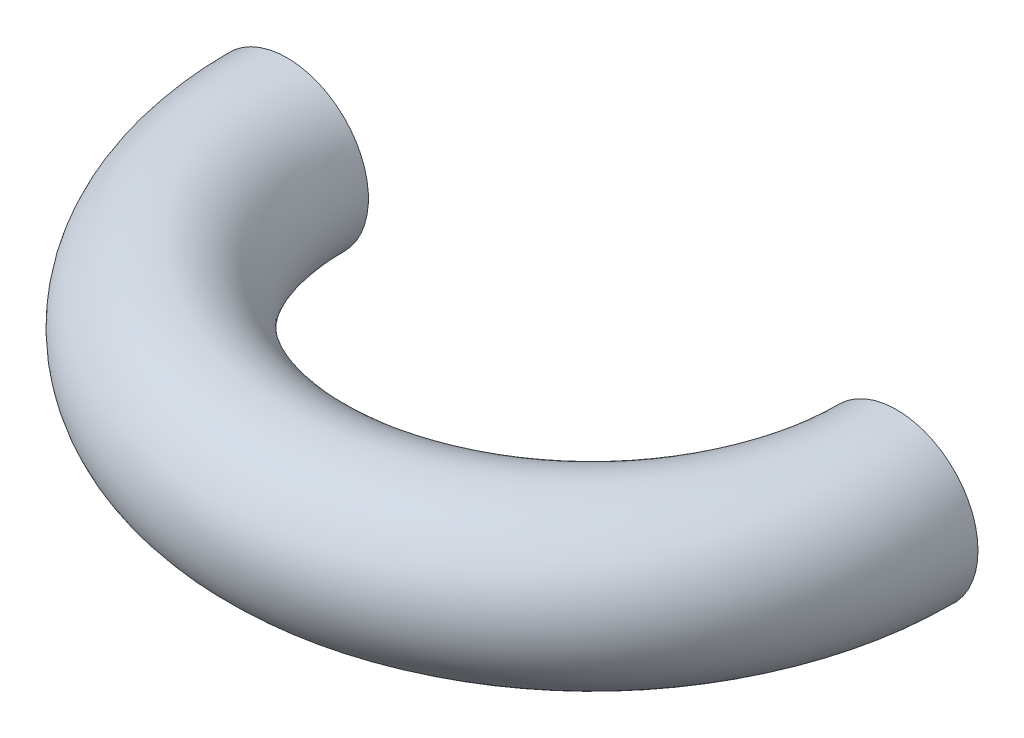
ISO-10303-21;
HEADER;
FILE_DESCRIPTION(('STEP AP214'),'2;1');
FILE_NAME('part.step','',(''),(''),'','','');
FILE_SCHEMA(('AUTOMOTIVE_DESIGN { 1 0 10303 214 1 1 1 1 }'));
ENDSEC;
DATA;
#1=APPLICATION_CONTEXT('core data for automotive mechanical design processes');
#2=APPLICATION_PROTOCOL_DEFINITION('international standard','automotive_design',2000,#1);
#3=PRODUCT_CONTEXT('',#1,'mechanical');
#4=PRODUCT('Part','Part','',(#3));
#5=PRODUCT_RELATED_PRODUCT_CATEGORY('part','',(#4));
#6=PRODUCT_DEFINITION_FORMATION('','',#4);
#7=PRODUCT_DEFINITION_CONTEXT('part definition',#1,'design');
#8=PRODUCT_DEFINITION('design','',#6,#7);
#9=PRODUCT_DEFINITION_SHAPE('','',#8);
#10=(LENGTH_UNIT() NAMED_UNIT(*) SI_UNIT(.MILLI.,.METRE.));
#11=(NAMED_UNIT(*) PLANE_ANGLE_UNIT() SI_UNIT($,.RADIAN.));
#12=(NAMED_UNIT(*) SI_UNIT($,.STERADIAN.) SOLID_ANGLE_UNIT());
#13=UNCERTAINTY_MEASURE_WITH_UNIT(LENGTH_MEASURE(1.E-05),#10,'distance_accuracy_value','');
#14=(GEOMETRIC_REPRESENTATION_CONTEXT(3) GLOBAL_UNCERTAINTY_ASSIGNED_CONTEXT((#13)) GLOBAL_UNIT_ASSIGNED_CONTEXT((#10,
#11,#12)) REPRESENTATION_CONTEXT('',''));
#15=CARTESIAN_POINT('',(0.,0.,0.));
#16=DIRECTION('',(0.,0.,1.));
#17=DIRECTION('',(1.,0.,0.));
#18=AXIS2_PLACEMENT_3D('',#15,#16,#17);
#19=CARTESIAN_POINT('',(0.,0.,0.));
#20=DIRECTION('',(0.,1.,0.));
#21=DIRECTION('',(0.,0.,1.));
#22=AXIS2_PLACEMENT_3D('',#19,#20,#21);
#23=TOROIDAL_SURFACE('',#22,3.75,1.);
#24=CARTESIAN_POINT('',(-3.75,0.,0.));
#25=DIRECTION('',(0.,0.,-1.));
#26=DIRECTION('',(-1.,0.,0.));
#27=AXIS2_PLACEMENT_3D('',#24,#25,#26);
#28=CIRCLE('',#27,1.);
#29=CARTESIAN_POINT('',(-4.75,0.,0.));
#30=VERTEX_POINT('',#29);
#31=EDGE_CURVE('E10',#30,#30,#28,.T.);
#32=CARTESIAN_POINT('',(3.75,0.,0.));
#33=DIRECTION('',(0.,0.,1.));
#34=DIRECTION('',(1.,0.,0.));
#35=AXIS2_PLACEMENT_3D('',#32,#33,#34);
#36=CIRCLE('',#35,1.);
#37=CARTESIAN_POINT('',(4.75,0.,0.));
#38=VERTEX_POINT('',#37);
#39=EDGE_CURVE('E36',#38,#38,#36,.T.);
#40=CARTESIAN_POINT('',(0.,0.,0.));
#41=DIRECTION('',(0.,1.,0.));
#42=DIRECTION('',(0.,0.,1.));
#43=AXIS2_PLACEMENT_3D('',#40,#41,#42);
#44=CIRCLE('',#43,4.75);
#45=EDGE_CURVE('',#30,#38,#44,.T.);
#46=ORIENTED_EDGE('',*,*,#31,.F.);
#47=ORIENTED_EDGE('',*,*,#39,.T.);
#48=ORIENTED_EDGE('',*,*,#45,.T.);
#49=ORIENTED_EDGE('',*,*,#45,.F.);
#50=EDGE_LOOP('',(#46,#48,#47,#49));
#51=FACE_BOUND('',#50,.T.);
#52=ADVANCED_FACE('F30',(#51),#23,.T.);
#53=CARTESIAN_POINT('',(-3.75,0.,0.));
#54=DIRECTION('',(0.,0.,-1.));
#55=DIRECTION('',(-1.,0.,0.));
#56=AXIS2_PLACEMENT_3D('',#53,#54,#55);
#57=PLANE('',#56);
#58=ORIENTED_EDGE('',*,*,#31,.T.);
#59=EDGE_LOOP('',(#58));
#60=FACE_BOUND('',#59,.T.);
#61=ADVANCED_FACE('F45',(#60),#57,.T.);
#62=CARTESIAN_POINT('',(3.75,0.,0.));
#63=DIRECTION('',(0.,0.,1.));
#64=DIRECTION('',(1.,0.,0.));
#65=AXIS2_PLACEMENT_3D('',#62,#63,#64);
#66=PLANE('',#65);
#67=ORIENTED_EDGE('',*,*,#39,.F.);
#68=EDGE_LOOP('',(#67));
#69=FACE_BOUND('',#68,.T.);
#70=ADVANCED_FACE('F43',(#69),#66,.F.);
#71=CLOSED_SHELL('',(#52,#61,#70));
#72=MANIFOLD_SOLID_BREP('B2',#71);
#73=ADVANCED_BREP_SHAPE_REPRESENTATION('',(#18,#72),#14);
#74=SHAPE_DEFINITION_REPRESENTATION(#9,#73);
ENDSEC;
END-ISO-10303-21;
